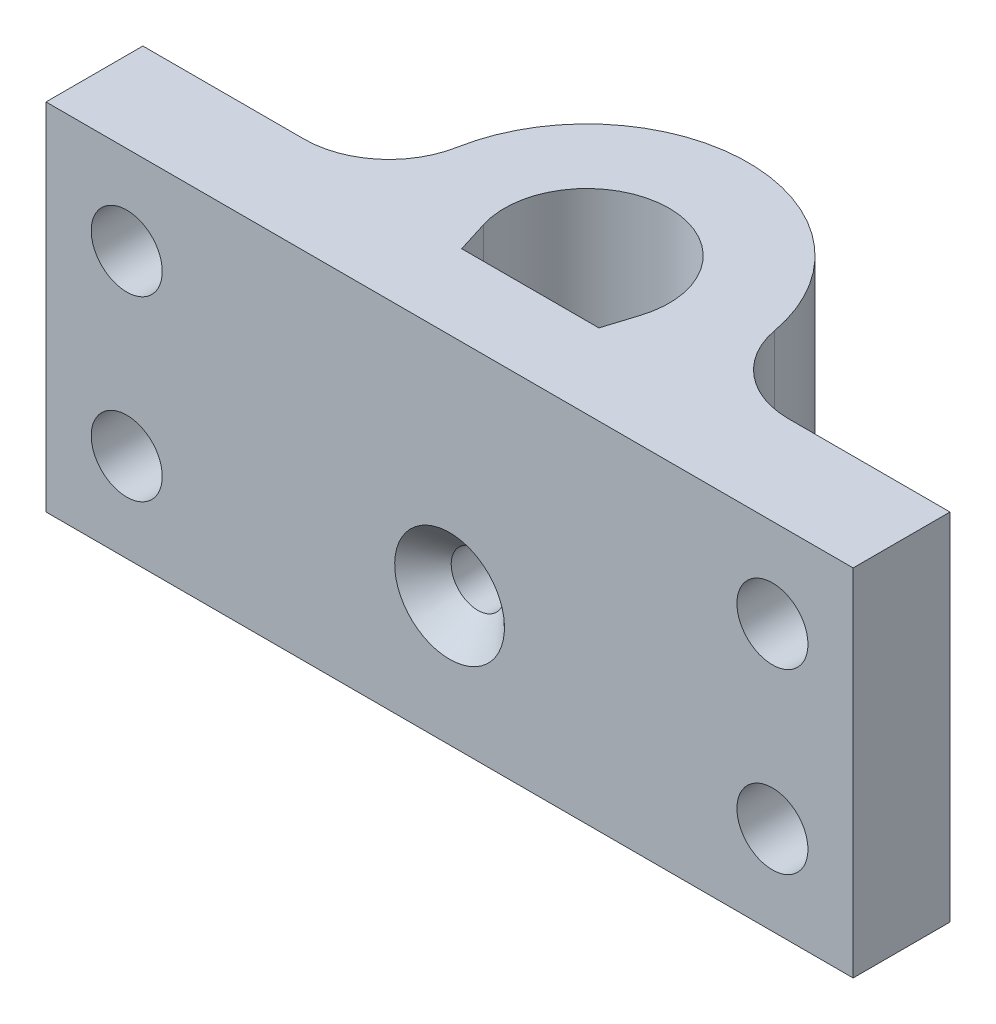
ISO-10303-21;
HEADER;
FILE_DESCRIPTION(('STEP AP214'),'2;1');
FILE_NAME('part.step','',(''),(''),'','','');
FILE_SCHEMA(('AUTOMOTIVE_DESIGN { 1 0 10303 214 1 1 1 1 }'));
ENDSEC;
DATA;
#1=APPLICATION_CONTEXT('core data for automotive mechanical design processes');
#2=APPLICATION_PROTOCOL_DEFINITION('international standard','automotive_design',2000,#1);
#3=PRODUCT_CONTEXT('',#1,'mechanical');
#4=PRODUCT('Part','Part','',(#3));
#5=PRODUCT_RELATED_PRODUCT_CATEGORY('part','',(#4));
#6=PRODUCT_DEFINITION_FORMATION('','',#4);
#7=PRODUCT_DEFINITION_CONTEXT('part definition',#1,'design');
#8=PRODUCT_DEFINITION('design','',#6,#7);
#9=PRODUCT_DEFINITION_SHAPE('','',#8);
#10=(LENGTH_UNIT() NAMED_UNIT(*) SI_UNIT(.MILLI.,.METRE.));
#11=(NAMED_UNIT(*) PLANE_ANGLE_UNIT() SI_UNIT($,.RADIAN.));
#12=(NAMED_UNIT(*) SI_UNIT($,.STERADIAN.) SOLID_ANGLE_UNIT());
#13=UNCERTAINTY_MEASURE_WITH_UNIT(LENGTH_MEASURE(1.E-05),#10,'distance_accuracy_value','');
#14=(GEOMETRIC_REPRESENTATION_CONTEXT(3) GLOBAL_UNCERTAINTY_ASSIGNED_CONTEXT((#13)) GLOBAL_UNIT_ASSIGNED_CONTEXT((#10,
#11,#12)) REPRESENTATION_CONTEXT('',''));
#15=CARTESIAN_POINT('',(0.,0.,0.));
#16=DIRECTION('',(0.,0.,1.));
#17=DIRECTION('',(1.,0.,0.));
#18=AXIS2_PLACEMENT_3D('',#15,#16,#17);
#19=CARTESIAN_POINT('',(-25.,22.,8.5));
#20=DIRECTION('',(0.,0.,-1.));
#21=DIRECTION('',(-1.,0.,0.));
#22=AXIS2_PLACEMENT_3D('',#19,#20,#21);
#23=PLANE('',#22);
#24=CARTESIAN_POINT('',(20.,5.5,8.5));
#25=DIRECTION('',(0.,0.,1.));
#26=DIRECTION('',(1.,0.,0.));
#27=AXIS2_PLACEMENT_3D('',#24,#25,#26);
#28=CIRCLE('',#27,2.2);
#29=CARTESIAN_POINT('',(22.2,5.5,8.5));
#30=VERTEX_POINT('',#29);
#31=EDGE_CURVE('E469',#30,#30,#28,.T.);
#32=ORIENTED_EDGE('',*,*,#31,.F.);
#33=EDGE_LOOP('',(#32));
#34=FACE_BOUND('',#33,.T.);
#35=CARTESIAN_POINT('',(20.,16.5,8.5));
#36=DIRECTION('',(0.,0.,1.));
#37=DIRECTION('',(1.,0.,0.));
#38=AXIS2_PLACEMENT_3D('',#35,#36,#37);
#39=CIRCLE('',#38,2.2);
#40=CARTESIAN_POINT('',(22.2,16.5,8.5));
#41=VERTEX_POINT('',#40);
#42=EDGE_CURVE('E445',#41,#41,#39,.T.);
#43=ORIENTED_EDGE('',*,*,#42,.F.);
#44=EDGE_LOOP('',(#43));
#45=FACE_BOUND('',#44,.T.);
#46=DIRECTION('',(1.,0.,0.));
#47=VECTOR('',#46,1.);
#48=CARTESIAN_POINT('',(-25.,0.,8.5));
#49=LINE('',#48,#47);
#50=CARTESIAN_POINT('',(-25.,0.,8.5));
#51=VERTEX_POINT('',#50);
#52=CARTESIAN_POINT('',(25.,0.,8.5));
#53=VERTEX_POINT('',#52);
#54=EDGE_CURVE('E199',#51,#53,#49,.T.);
#55=ORIENTED_EDGE('',*,*,#54,.T.);
#56=DIRECTION('',(0.,-1.,0.));
#57=VECTOR('',#56,1.);
#58=CARTESIAN_POINT('',(25.,22.,8.5));
#59=LINE('',#58,#57);
#60=CARTESIAN_POINT('',(25.,22.,8.5));
#61=VERTEX_POINT('',#60);
#62=EDGE_CURVE('E220',#61,#53,#59,.T.);
#63=ORIENTED_EDGE('',*,*,#62,.F.);
#64=DIRECTION('',(1.,0.,0.));
#65=VECTOR('',#64,1.);
#66=CARTESIAN_POINT('',(-25.,22.,8.5));
#67=LINE('',#66,#65);
#68=CARTESIAN_POINT('',(-25.,22.,8.5));
#69=VERTEX_POINT('',#68);
#70=EDGE_CURVE('E217',#69,#61,#67,.T.);
#71=ORIENTED_EDGE('',*,*,#70,.F.);
#72=DIRECTION('',(0.,-1.,0.));
#73=VECTOR('',#72,1.);
#74=CARTESIAN_POINT('',(-25.,22.,8.5));
#75=LINE('',#74,#73);
#76=EDGE_CURVE('E247',#69,#51,#75,.T.);
#77=ORIENTED_EDGE('',*,*,#76,.T.);
#78=EDGE_LOOP('',(#55,#63,#71,#77));
#79=FACE_BOUND('',#78,.T.);
#80=CARTESIAN_POINT('',(0.,8.,8.5));
#81=DIRECTION('',(0.,0.,1.));
#82=DIRECTION('',(0.,-1.,0.));
#83=AXIS2_PLACEMENT_3D('',#80,#81,#82);
#84=CIRCLE('',#83,3.4);
#85=CARTESIAN_POINT('',(0.,4.6,8.5));
#86=VERTEX_POINT('',#85);
#87=EDGE_CURVE('E436',#86,#86,#84,.T.);
#88=ORIENTED_EDGE('',*,*,#87,.F.);
#89=EDGE_LOOP('',(#88));
#90=FACE_BOUND('',#89,.T.);
#91=CARTESIAN_POINT('',(-20.,16.5,8.5));
#92=DIRECTION('',(0.,0.,1.));
#93=DIRECTION('',(1.,0.,0.));
#94=AXIS2_PLACEMENT_3D('',#91,#92,#93);
#95=CIRCLE('',#94,2.2);
#96=CARTESIAN_POINT('',(-17.8,16.5,8.5));
#97=VERTEX_POINT('',#96);
#98=EDGE_CURVE('E457',#97,#97,#95,.T.);
#99=ORIENTED_EDGE('',*,*,#98,.F.);
#100=EDGE_LOOP('',(#99));
#101=FACE_BOUND('',#100,.T.);
#102=CARTESIAN_POINT('',(-20.,5.5,8.5));
#103=DIRECTION('',(0.,0.,1.));
#104=DIRECTION('',(1.,0.,0.));
#105=AXIS2_PLACEMENT_3D('',#102,#103,#104);
#106=CIRCLE('',#105,2.2);
#107=CARTESIAN_POINT('',(-17.8,5.5,8.5));
#108=VERTEX_POINT('',#107);
#109=EDGE_CURVE('E481',#108,#108,#106,.T.);
#110=ORIENTED_EDGE('',*,*,#109,.F.);
#111=EDGE_LOOP('',(#110));
#112=FACE_BOUND('',#111,.T.);
#113=ADVANCED_FACE('F17',(#34,#45,#79,#90,#101,#112),#23,.F.);
#114=CARTESIAN_POINT('',(-25.,22.,2.5));
#115=DIRECTION('',(0.,0.,1.));
#116=DIRECTION('',(1.,0.,0.));
#117=AXIS2_PLACEMENT_3D('',#114,#115,#116);
#118=PLANE('',#117);
#119=CARTESIAN_POINT('',(-20.,16.5,2.5));
#120=DIRECTION('',(0.,0.,1.));
#121=DIRECTION('',(1.,0.,0.));
#122=AXIS2_PLACEMENT_3D('',#119,#120,#121);
#123=CIRCLE('',#122,4.5);
#124=CARTESIAN_POINT('',(-15.5,16.5,2.5));
#125=VERTEX_POINT('',#124);
#126=EDGE_CURVE('E461',#125,#125,#123,.T.);
#127=ORIENTED_EDGE('',*,*,#126,.T.);
#128=EDGE_LOOP('',(#127));
#129=FACE_BOUND('',#128,.T.);
#130=DIRECTION('',(-1.,0.,0.));
#131=VECTOR('',#130,1.);
#132=CARTESIAN_POINT('',(-25.,0.,2.5));
#133=LINE('',#132,#131);
#134=CARTESIAN_POINT('',(-15.,0.,2.5));
#135=VERTEX_POINT('',#134);
#136=CARTESIAN_POINT('',(-25.,0.,2.5));
#137=VERTEX_POINT('',#136);
#138=EDGE_CURVE('E236',#135,#137,#133,.T.);
#139=ORIENTED_EDGE('',*,*,#138,.T.);
#140=DIRECTION('',(0.,-1.,0.));
#141=VECTOR('',#140,1.);
#142=CARTESIAN_POINT('',(-25.,22.,2.5));
#143=LINE('',#142,#141);
#144=CARTESIAN_POINT('',(-25.,22.,2.5));
#145=VERTEX_POINT('',#144);
#146=EDGE_CURVE('E251',#145,#137,#143,.T.);
#147=ORIENTED_EDGE('',*,*,#146,.F.);
#148=DIRECTION('',(-1.,0.,0.));
#149=VECTOR('',#148,1.);
#150=CARTESIAN_POINT('',(-25.,22.,2.5));
#151=LINE('',#150,#149);
#152=CARTESIAN_POINT('',(-15.,22.,2.5));
#153=VERTEX_POINT('',#152);
#154=EDGE_CURVE('E211',#153,#145,#151,.T.);
#155=ORIENTED_EDGE('',*,*,#154,.F.);
#156=DIRECTION('',(0.,-1.,0.));
#157=VECTOR('',#156,1.);
#158=CARTESIAN_POINT('',(-15.,22.,2.5));
#159=LINE('',#158,#157);
#160=EDGE_CURVE('E255',#153,#135,#159,.T.);
#161=ORIENTED_EDGE('',*,*,#160,.T.);
#162=EDGE_LOOP('',(#139,#147,#155,#161));
#163=FACE_BOUND('',#162,.T.);
#164=CARTESIAN_POINT('',(-20.,5.5,2.5));
#165=DIRECTION('',(0.,0.,1.));
#166=DIRECTION('',(1.,0.,0.));
#167=AXIS2_PLACEMENT_3D('',#164,#165,#166);
#168=CIRCLE('',#167,4.5);
#169=CARTESIAN_POINT('',(-15.5,5.5,2.5));
#170=VERTEX_POINT('',#169);
#171=EDGE_CURVE('E485',#170,#170,#168,.T.);
#172=ORIENTED_EDGE('',*,*,#171,.T.);
#173=EDGE_LOOP('',(#172));
#174=FACE_BOUND('',#173,.T.);
#175=ADVANCED_FACE('F352',(#129,#163,#174),#118,.F.);
#176=CARTESIAN_POINT('',(25.,22.,2.5));
#177=DIRECTION('',(0.,0.,1.));
#178=DIRECTION('',(1.,0.,0.));
#179=AXIS2_PLACEMENT_3D('',#176,#177,#178);
#180=PLANE('',#179);
#181=CARTESIAN_POINT('',(20.,16.5,2.5));
#182=DIRECTION('',(0.,0.,1.));
#183=DIRECTION('',(1.,0.,0.));
#184=AXIS2_PLACEMENT_3D('',#181,#182,#183);
#185=CIRCLE('',#184,4.5);
#186=CARTESIAN_POINT('',(24.5,16.5,2.5));
#187=VERTEX_POINT('',#186);
#188=EDGE_CURVE('E449',#187,#187,#185,.T.);
#189=ORIENTED_EDGE('',*,*,#188,.T.);
#190=EDGE_LOOP('',(#189));
#191=FACE_BOUND('',#190,.T.);
#192=DIRECTION('',(-1.,0.,0.));
#193=VECTOR('',#192,1.);
#194=CARTESIAN_POINT('',(25.,0.,2.5));
#195=LINE('',#194,#193);
#196=CARTESIAN_POINT('',(25.,0.,2.5));
#197=VERTEX_POINT('',#196);
#198=CARTESIAN_POINT('',(15.,0.,2.5));
#199=VERTEX_POINT('',#198);
#200=EDGE_CURVE('E224',#197,#199,#195,.T.);
#201=ORIENTED_EDGE('',*,*,#200,.T.);
#202=DIRECTION('',(0.,-1.,0.));
#203=VECTOR('',#202,1.);
#204=CARTESIAN_POINT('',(15.,22.,2.5));
#205=LINE('',#204,#203);
#206=CARTESIAN_POINT('',(15.,22.,2.5));
#207=VERTEX_POINT('',#206);
#208=EDGE_CURVE('E267',#207,#199,#205,.T.);
#209=ORIENTED_EDGE('',*,*,#208,.F.);
#210=DIRECTION('',(-1.,0.,0.));
#211=VECTOR('',#210,1.);
#212=CARTESIAN_POINT('',(25.,22.,2.5));
#213=LINE('',#212,#211);
#214=CARTESIAN_POINT('',(25.,22.,2.5));
#215=VERTEX_POINT('',#214);
#216=EDGE_CURVE('E198',#215,#207,#213,.T.);
#217=ORIENTED_EDGE('',*,*,#216,.F.);
#218=DIRECTION('',(0.,-1.,0.));
#219=VECTOR('',#218,1.);
#220=CARTESIAN_POINT('',(25.,22.,2.5));
#221=LINE('',#220,#219);
#222=EDGE_CURVE('E271',#215,#197,#221,.T.);
#223=ORIENTED_EDGE('',*,*,#222,.T.);
#224=EDGE_LOOP('',(#201,#209,#217,#223));
#225=FACE_BOUND('',#224,.T.);
#226=CARTESIAN_POINT('',(20.,5.5,2.5));
#227=DIRECTION('',(0.,0.,1.));
#228=DIRECTION('',(1.,0.,0.));
#229=AXIS2_PLACEMENT_3D('',#226,#227,#228);
#230=CIRCLE('',#229,4.5);
#231=CARTESIAN_POINT('',(24.5,5.5,2.5));
#232=VERTEX_POINT('',#231);
#233=EDGE_CURVE('E473',#232,#232,#230,.T.);
#234=ORIENTED_EDGE('',*,*,#233,.T.);
#235=EDGE_LOOP('',(#234));
#236=FACE_BOUND('',#235,.T.);
#237=ADVANCED_FACE('F369',(#191,#225,#236),#180,.F.);
#238=CARTESIAN_POINT('',(0.,8.,-1.16690475583121));
#239=DIRECTION('',(0.,0.,1.));
#240=DIRECTION('',(1.,0.,0.));
#241=AXIS2_PLACEMENT_3D('',#238,#239,#240);
#242=CYLINDRICAL_SURFACE('',#241,1.65);
#243=CARTESIAN_POINT('',(0.,8.,3.5));
#244=DIRECTION('',(0.,0.,-1.));
#245=DIRECTION('',(-1.,0.,0.));
#246=AXIS2_PLACEMENT_3D('',#243,#244,#245);
#247=CIRCLE('',#246,1.65);
#248=CARTESIAN_POINT('',(-1.65,8.,3.5));
#249=VERTEX_POINT('',#248);
#250=EDGE_CURVE('E299',#249,#249,#247,.F.);
#251=ORIENTED_EDGE('',*,*,#250,.F.);
#252=EDGE_LOOP('',(#251));
#253=FACE_BOUND('',#252,.T.);
#254=CARTESIAN_POINT('',(0.,8.,6.75));
#255=DIRECTION('',(0.,0.,1.));
#256=DIRECTION('',(0.,-1.,0.));
#257=AXIS2_PLACEMENT_3D('',#254,#255,#256);
#258=CIRCLE('',#257,1.65);
#259=CARTESIAN_POINT('',(0.,6.35,6.75));
#260=VERTEX_POINT('',#259);
#261=EDGE_CURVE('E21',#260,#260,#258,.F.);
#262=ORIENTED_EDGE('',*,*,#261,.F.);
#263=EDGE_LOOP('',(#262));
#264=FACE_BOUND('',#263,.T.);
#265=ADVANCED_FACE('F373',(#253,#264),#242,.F.);
#266=CARTESIAN_POINT('',(15.,22.,-2.75));
#267=DIRECTION('',(0.,1.,0.));
#268=DIRECTION('',(0.,0.,1.));
#269=AXIS2_PLACEMENT_3D('',#266,#267,#268);
#270=PLANE('',#269);
#271=DIRECTION('',(0.,0.,-1.));
#272=VECTOR('',#271,1.);
#273=CARTESIAN_POINT('',(25.,22.,8.5));
#274=LINE('',#273,#272);
#275=EDGE_CURVE('E194',#61,#215,#274,.T.);
#276=ORIENTED_EDGE('',*,*,#275,.T.);
#277=ORIENTED_EDGE('',*,*,#216,.T.);
#278=CARTESIAN_POINT('',(15.,22.,-2.75));
#279=DIRECTION('',(0.,-1.,0.));
#280=DIRECTION('',(0.,0.,1.));
#281=AXIS2_PLACEMENT_3D('',#278,#279,#280);
#282=CIRCLE('',#281,5.25);
#283=CARTESIAN_POINT('',(9.83606557377049,22.,-1.80327868852459));
#284=VERTEX_POINT('',#283);
#285=EDGE_CURVE('E202',#207,#284,#282,.T.);
#286=ORIENTED_EDGE('',*,*,#285,.T.);
#287=CARTESIAN_POINT('',(0.,22.,0.));
#288=DIRECTION('',(0.,1.,0.));
#289=DIRECTION('',(0.,0.,-1.));
#290=AXIS2_PLACEMENT_3D('',#287,#288,#289);
#291=CIRCLE('',#290,10.);
#292=CARTESIAN_POINT('',(-9.83606557377049,22.,-1.80327868852459));
#293=VERTEX_POINT('',#292);
#294=EDGE_CURVE('E205',#284,#293,#291,.T.);
#295=ORIENTED_EDGE('',*,*,#294,.T.);
#296=CARTESIAN_POINT('',(-15.,22.,-2.75));
#297=DIRECTION('',(0.,-1.,0.));
#298=DIRECTION('',(0.,0.,-1.));
#299=AXIS2_PLACEMENT_3D('',#296,#297,#298);
#300=CIRCLE('',#299,5.25);
#301=EDGE_CURVE('E208',#293,#153,#300,.T.);
#302=ORIENTED_EDGE('',*,*,#301,.T.);
#303=ORIENTED_EDGE('',*,*,#154,.T.);
#304=DIRECTION('',(0.,0.,1.));
#305=VECTOR('',#304,1.);
#306=CARTESIAN_POINT('',(-25.,22.,8.5));
#307=LINE('',#306,#305);
#308=EDGE_CURVE('E214',#145,#69,#307,.T.);
#309=ORIENTED_EDGE('',*,*,#308,.T.);
#310=ORIENTED_EDGE('',*,*,#70,.T.);
#311=EDGE_LOOP('',(#276,#277,#286,#295,#302,#303,#309,#310));
#312=FACE_BOUND('',#311,.T.);
#313=DIRECTION('',(0.298043740440614,0.,-0.954552213754789));
#314=VECTOR('',#313,1.);
#315=CARTESIAN_POINT('',(4.25,22.,3.5));
#316=LINE('',#315,#314);
#317=CARTESIAN_POINT('',(4.25,22.,3.5));
#318=VERTEX_POINT('',#317);
#319=CARTESIAN_POINT('',(4.86821629014943,22.,1.52002307624713));
#320=VERTEX_POINT('',#319);
#321=EDGE_CURVE('E159',#318,#320,#316,.T.);
#322=ORIENTED_EDGE('',*,*,#321,.F.);
#323=DIRECTION('',(1.,0.,0.));
#324=VECTOR('',#323,1.);
#325=CARTESIAN_POINT('',(-3.70944739819828,22.,3.5));
#326=LINE('',#325,#324);
#327=CARTESIAN_POINT('',(-4.25,22.,3.5));
#328=VERTEX_POINT('',#327);
#329=EDGE_CURVE('E150',#328,#318,#326,.T.);
#330=ORIENTED_EDGE('',*,*,#329,.F.);
#331=DIRECTION('',(0.298043740440614,0.,0.954552213754789));
#332=VECTOR('',#331,1.);
#333=CARTESIAN_POINT('',(-4.25,22.,3.5));
#334=LINE('',#333,#332);
#335=CARTESIAN_POINT('',(-4.86821629014942,22.,1.52002307624713));
#336=VERTEX_POINT('',#335);
#337=EDGE_CURVE('E181',#336,#328,#334,.T.);
#338=ORIENTED_EDGE('',*,*,#337,.F.);
#339=CARTESIAN_POINT('',(0.,22.,0.));
#340=DIRECTION('',(0.,1.,0.));
#341=DIRECTION('',(0.,0.,-1.));
#342=AXIS2_PLACEMENT_3D('',#339,#340,#341);
#343=CIRCLE('',#342,5.1);
#344=EDGE_CURVE('E176',#320,#336,#343,.T.);
#345=ORIENTED_EDGE('',*,*,#344,.F.);
#346=EDGE_LOOP('',(#322,#330,#338,#345));
#347=FACE_BOUND('',#346,.T.);
#348=ADVANCED_FACE('F174',(#312,#347),#270,.T.);
#349=CARTESIAN_POINT('',(15.,0.,-2.75));
#350=DIRECTION('',(0.,1.,0.));
#351=DIRECTION('',(0.,0.,1.));
#352=AXIS2_PLACEMENT_3D('',#349,#350,#351);
#353=PLANE('',#352);
#354=DIRECTION('',(1.,0.,0.));
#355=VECTOR('',#354,1.);
#356=CARTESIAN_POINT('',(4.25,0.,4.36602540378445));
#357=LINE('',#356,#355);
#358=CARTESIAN_POINT('',(-4.88685563174452,0.,4.36602540378445));
#359=VERTEX_POINT('',#358);
#360=CARTESIAN_POINT('',(4.88685563174452,0.,4.36602540378445));
#361=VERTEX_POINT('',#360);
#362=EDGE_CURVE('E278',#359,#361,#357,.T.);
#363=ORIENTED_EDGE('',*,*,#362,.T.);
#364=DIRECTION('',(0.298043740440614,0.,-0.954552213754789));
#365=VECTOR('',#364,1.);
#366=CARTESIAN_POINT('',(5.69488275649975,0.,1.77813652690764));
#367=LINE('',#366,#365);
#368=CARTESIAN_POINT('',(5.69488275649975,0.,1.77813652690764));
#369=VERTEX_POINT('',#368);
#370=EDGE_CURVE('E284',#361,#369,#367,.T.);
#371=ORIENTED_EDGE('',*,*,#370,.T.);
#372=CARTESIAN_POINT('',(0.,0.,0.));
#373=DIRECTION('',(0.,1.,0.));
#374=DIRECTION('',(0.,0.,1.));
#375=AXIS2_PLACEMENT_3D('',#372,#373,#374);
#376=CIRCLE('',#375,5.96602540378445);
#377=CARTESIAN_POINT('',(-5.69488275649975,0.,1.77813652690764));
#378=VERTEX_POINT('',#377);
#379=EDGE_CURVE('E281',#369,#378,#376,.T.);
#380=ORIENTED_EDGE('',*,*,#379,.T.);
#381=DIRECTION('',(0.298043740440614,0.,0.954552213754789));
#382=VECTOR('',#381,1.);
#383=CARTESIAN_POINT('',(-5.07666646635033,0.,3.75811345066051));
#384=LINE('',#383,#382);
#385=EDGE_CURVE('E275',#378,#359,#384,.T.);
#386=ORIENTED_EDGE('',*,*,#385,.T.);
#387=EDGE_LOOP('',(#363,#371,#380,#386));
#388=FACE_BOUND('',#387,.T.);
#389=DIRECTION('',(0.,0.,-1.));
#390=VECTOR('',#389,1.);
#391=CARTESIAN_POINT('',(25.,0.,8.5));
#392=LINE('',#391,#390);
#393=EDGE_CURVE('E170',#53,#197,#392,.T.);
#394=ORIENTED_EDGE('',*,*,#393,.F.);
#395=ORIENTED_EDGE('',*,*,#54,.F.);
#396=DIRECTION('',(0.,0.,1.));
#397=VECTOR('',#396,1.);
#398=CARTESIAN_POINT('',(-25.,0.,8.5));
#399=LINE('',#398,#397);
#400=EDGE_CURVE('E239',#137,#51,#399,.T.);
#401=ORIENTED_EDGE('',*,*,#400,.F.);
#402=ORIENTED_EDGE('',*,*,#138,.F.);
#403=CARTESIAN_POINT('',(-15.,0.,-2.75));
#404=DIRECTION('',(0.,-1.,0.));
#405=DIRECTION('',(0.,0.,-1.));
#406=AXIS2_PLACEMENT_3D('',#403,#404,#405);
#407=CIRCLE('',#406,5.25);
#408=CARTESIAN_POINT('',(-9.83606557377049,0.,-1.80327868852459));
#409=VERTEX_POINT('',#408);
#410=EDGE_CURVE('E233',#409,#135,#407,.T.);
#411=ORIENTED_EDGE('',*,*,#410,.F.);
#412=CARTESIAN_POINT('',(0.,0.,0.));
#413=DIRECTION('',(0.,1.,0.));
#414=DIRECTION('',(0.,0.,-1.));
#415=AXIS2_PLACEMENT_3D('',#412,#413,#414);
#416=CIRCLE('',#415,10.);
#417=CARTESIAN_POINT('',(9.83606557377049,0.,-1.80327868852459));
#418=VERTEX_POINT('',#417);
#419=EDGE_CURVE('E230',#418,#409,#416,.T.);
#420=ORIENTED_EDGE('',*,*,#419,.F.);
#421=CARTESIAN_POINT('',(15.,0.,-2.75));
#422=DIRECTION('',(0.,-1.,0.));
#423=DIRECTION('',(0.,0.,1.));
#424=AXIS2_PLACEMENT_3D('',#421,#422,#423);
#425=CIRCLE('',#424,5.25);
#426=EDGE_CURVE('E227',#199,#418,#425,.T.);
#427=ORIENTED_EDGE('',*,*,#426,.F.);
#428=ORIENTED_EDGE('',*,*,#200,.F.);
#429=EDGE_LOOP('',(#394,#395,#401,#402,#411,#420,#427,#428));
#430=FACE_BOUND('',#429,.T.);
#431=ADVANCED_FACE('F327',(#388,#430),#353,.F.);
#432=CARTESIAN_POINT('',(25.,22.,8.5));
#433=DIRECTION('',(-1.,0.,0.));
#434=DIRECTION('',(0.,0.,1.));
#435=AXIS2_PLACEMENT_3D('',#432,#433,#434);
#436=PLANE('',#435);
#437=ORIENTED_EDGE('',*,*,#393,.T.);
#438=ORIENTED_EDGE('',*,*,#222,.F.);
#439=ORIENTED_EDGE('',*,*,#275,.F.);
#440=ORIENTED_EDGE('',*,*,#62,.T.);
#441=EDGE_LOOP('',(#437,#438,#439,#440));
#442=FACE_BOUND('',#441,.T.);
#443=ADVANCED_FACE('F330',(#442),#436,.F.);
#444=CARTESIAN_POINT('',(15.,22.,-2.75));
#445=DIRECTION('',(0.,-1.,0.));
#446=DIRECTION('',(0.,0.,-1.));
#447=AXIS2_PLACEMENT_3D('',#444,#445,#446);
#448=CYLINDRICAL_SURFACE('',#447,5.25);
#449=ORIENTED_EDGE('',*,*,#426,.T.);
#450=DIRECTION('',(0.,-1.,0.));
#451=VECTOR('',#450,1.);
#452=CARTESIAN_POINT('',(9.83606557377049,22.,-1.80327868852459));
#453=LINE('',#452,#451);
#454=EDGE_CURVE('E263',#284,#418,#453,.T.);
#455=ORIENTED_EDGE('',*,*,#454,.F.);
#456=ORIENTED_EDGE('',*,*,#285,.F.);
#457=ORIENTED_EDGE('',*,*,#208,.T.);
#458=EDGE_LOOP('',(#449,#455,#456,#457));
#459=FACE_BOUND('',#458,.T.);
#460=ADVANCED_FACE('F365',(#459),#448,.F.);
#461=CARTESIAN_POINT('',(0.,22.,0.));
#462=DIRECTION('',(0.,-1.,0.));
#463=DIRECTION('',(0.,0.,-1.));
#464=AXIS2_PLACEMENT_3D('',#461,#462,#463);
#465=CYLINDRICAL_SURFACE('',#464,10.);
#466=ORIENTED_EDGE('',*,*,#419,.T.);
#467=DIRECTION('',(0.,-1.,0.));
#468=VECTOR('',#467,1.);
#469=CARTESIAN_POINT('',(-9.83606557377049,22.,-1.80327868852459));
#470=LINE('',#469,#468);
#471=EDGE_CURVE('E259',#293,#409,#470,.T.);
#472=ORIENTED_EDGE('',*,*,#471,.F.);
#473=ORIENTED_EDGE('',*,*,#294,.F.);
#474=ORIENTED_EDGE('',*,*,#454,.T.);
#475=EDGE_LOOP('',(#466,#472,#473,#474));
#476=FACE_BOUND('',#475,.T.);
#477=ADVANCED_FACE('F362',(#476),#465,.T.);
#478=CARTESIAN_POINT('',(-15.,22.,-2.75));
#479=DIRECTION('',(0.,-1.,0.));
#480=DIRECTION('',(0.,0.,-1.));
#481=AXIS2_PLACEMENT_3D('',#478,#479,#480);
#482=CYLINDRICAL_SURFACE('',#481,5.25);
#483=ORIENTED_EDGE('',*,*,#410,.T.);
#484=ORIENTED_EDGE('',*,*,#160,.F.);
#485=ORIENTED_EDGE('',*,*,#301,.F.);
#486=ORIENTED_EDGE('',*,*,#471,.T.);
#487=EDGE_LOOP('',(#483,#484,#485,#486));
#488=FACE_BOUND('',#487,.T.);
#489=ADVANCED_FACE('F358',(#488),#482,.F.);
#490=CARTESIAN_POINT('',(-25.,22.,8.5));
#491=DIRECTION('',(1.,0.,0.));
#492=DIRECTION('',(0.,0.,-1.));
#493=AXIS2_PLACEMENT_3D('',#490,#491,#492);
#494=PLANE('',#493);
#495=ORIENTED_EDGE('',*,*,#400,.T.);
#496=ORIENTED_EDGE('',*,*,#76,.F.);
#497=ORIENTED_EDGE('',*,*,#308,.F.);
#498=ORIENTED_EDGE('',*,*,#146,.T.);
#499=EDGE_LOOP('',(#495,#496,#497,#498));
#500=FACE_BOUND('',#499,.T.);
#501=ADVANCED_FACE('F346',(#500),#494,.F.);
#502=CARTESIAN_POINT('',(3.70944739819828,22.,3.5));
#503=DIRECTION('',(0.,0.,-1.));
#504=DIRECTION('',(-1.,0.,0.));
#505=AXIS2_PLACEMENT_3D('',#502,#503,#504);
#506=PLANE('',#505);
#507=ORIENTED_EDGE('',*,*,#250,.T.);
#508=EDGE_LOOP('',(#507));
#509=FACE_BOUND('',#508,.T.);
#510=DIRECTION('',(0.,-1.,0.));
#511=VECTOR('',#510,1.);
#512=CARTESIAN_POINT('',(4.25,22.,3.5));
#513=LINE('',#512,#511);
#514=CARTESIAN_POINT('',(4.25,1.5,3.5));
#515=VERTEX_POINT('',#514);
#516=EDGE_CURVE('E153',#318,#515,#513,.T.);
#517=ORIENTED_EDGE('',*,*,#516,.T.);
#518=DIRECTION('',(-1.,0.,0.));
#519=VECTOR('',#518,1.);
#520=CARTESIAN_POINT('',(-4.25,1.5,3.5));
#521=LINE('',#520,#519);
#522=CARTESIAN_POINT('',(-4.25,1.5,3.5));
#523=VERTEX_POINT('',#522);
#524=EDGE_CURVE('E27',#515,#523,#521,.T.);
#525=ORIENTED_EDGE('',*,*,#524,.T.);
#526=DIRECTION('',(0.,-1.,0.));
#527=VECTOR('',#526,1.);
#528=CARTESIAN_POINT('',(-4.25,22.,3.5));
#529=LINE('',#528,#527);
#530=EDGE_CURVE('E154',#328,#523,#529,.T.);
#531=ORIENTED_EDGE('',*,*,#530,.F.);
#532=ORIENTED_EDGE('',*,*,#329,.T.);
#533=EDGE_LOOP('',(#517,#525,#531,#532));
#534=FACE_BOUND('',#533,.T.);
#535=ADVANCED_FACE('F152',(#509,#534),#506,.T.);
#536=CARTESIAN_POINT('',(4.25,22.,3.5));
#537=DIRECTION('',(-0.954552213754789,0.,-0.298043740440614));
#538=DIRECTION('',(-0.298043740440614,0.,0.954552213754789));
#539=AXIS2_PLACEMENT_3D('',#536,#537,#538);
#540=PLANE('',#539);
#541=DIRECTION('',(0.,-1.,0.));
#542=VECTOR('',#541,1.);
#543=CARTESIAN_POINT('',(4.86821629014943,22.,1.52002307624713));
#544=LINE('',#543,#542);
#545=CARTESIAN_POINT('',(4.86821629014943,1.5,1.52002307624713));
#546=VERTEX_POINT('',#545);
#547=EDGE_CURVE('E171',#320,#546,#544,.T.);
#548=ORIENTED_EDGE('',*,*,#547,.T.);
#549=DIRECTION('',(-0.298043740440614,0.,0.954552213754789));
#550=VECTOR('',#549,1.);
#551=CARTESIAN_POINT('',(4.25,1.5,3.5));
#552=LINE('',#551,#550);
#553=EDGE_CURVE('E168',#546,#515,#552,.T.);
#554=ORIENTED_EDGE('',*,*,#553,.T.);
#555=ORIENTED_EDGE('',*,*,#516,.F.);
#556=ORIENTED_EDGE('',*,*,#321,.T.);
#557=EDGE_LOOP('',(#548,#554,#555,#556));
#558=FACE_BOUND('',#557,.T.);
#559=ADVANCED_FACE('F165',(#558),#540,.T.);
#560=CARTESIAN_POINT('',(0.,22.,0.));
#561=DIRECTION('',(0.,-1.,0.));
#562=DIRECTION('',(0.,0.,-1.));
#563=AXIS2_PLACEMENT_3D('',#560,#561,#562);
#564=CYLINDRICAL_SURFACE('',#563,5.1);
#565=DIRECTION('',(0.,-1.,0.));
#566=VECTOR('',#565,1.);
#567=CARTESIAN_POINT('',(-4.86821629014942,22.,1.52002307624713));
#568=LINE('',#567,#566);
#569=CARTESIAN_POINT('',(-4.86821629014942,1.5,1.52002307624713));
#570=VERTEX_POINT('',#569);
#571=EDGE_CURVE('E189',#336,#570,#568,.T.);
#572=ORIENTED_EDGE('',*,*,#571,.T.);
#573=CARTESIAN_POINT('',(0.,1.5,0.));
#574=DIRECTION('',(0.,1.,0.));
#575=DIRECTION('',(0.,0.,1.));
#576=AXIS2_PLACEMENT_3D('',#573,#574,#575);
#577=CIRCLE('',#576,5.1);
#578=EDGE_CURVE('E290',#570,#546,#577,.F.);
#579=ORIENTED_EDGE('',*,*,#578,.T.);
#580=ORIENTED_EDGE('',*,*,#547,.F.);
#581=ORIENTED_EDGE('',*,*,#344,.T.);
#582=EDGE_LOOP('',(#572,#579,#580,#581));
#583=FACE_BOUND('',#582,.T.);
#584=ADVANCED_FACE('F322',(#583),#564,.F.);
#585=CARTESIAN_POINT('',(-4.25,22.,3.5));
#586=DIRECTION('',(0.954552213754789,0.,-0.298043740440614));
#587=DIRECTION('',(-0.298043740440614,0.,-0.954552213754789));
#588=AXIS2_PLACEMENT_3D('',#585,#586,#587);
#589=PLANE('',#588);
#590=ORIENTED_EDGE('',*,*,#530,.T.);
#591=DIRECTION('',(-0.298043740440614,0.,-0.954552213754789));
#592=VECTOR('',#591,1.);
#593=CARTESIAN_POINT('',(-4.86821629014942,1.5,1.52002307624713));
#594=LINE('',#593,#592);
#595=EDGE_CURVE('E11',#523,#570,#594,.T.);
#596=ORIENTED_EDGE('',*,*,#595,.T.);
#597=ORIENTED_EDGE('',*,*,#571,.F.);
#598=ORIENTED_EDGE('',*,*,#337,.T.);
#599=EDGE_LOOP('',(#590,#596,#597,#598));
#600=FACE_BOUND('',#599,.T.);
#601=ADVANCED_FACE('F414',(#600),#589,.T.);
#602=CARTESIAN_POINT('',(-5.14480204690397,0.,3.53989390625136));
#603=DIRECTION('',(0.826666466350322,-0.5,-0.258113450660508));
#604=DIRECTION('',(0.517536939166172,0.855660865412524,0.));
#605=AXIS2_PLACEMENT_3D('',#602,#603,#604);
#606=PLANE('',#605);
#607=DIRECTION('',(-0.477276106877393,-0.86602540378444,0.149021870220306));
#608=VECTOR('',#607,1.);
#609=CARTESIAN_POINT('',(-4.86821629014942,1.5,1.52002307624713));
#610=LINE('',#609,#608);
#611=EDGE_CURVE('E302',#570,#378,#610,.T.);
#612=ORIENTED_EDGE('',*,*,#611,.F.);
#613=ORIENTED_EDGE('',*,*,#595,.F.);
#614=DIRECTION('',(-0.345100131988394,-0.812821889577412,0.469282936750739));
#615=VECTOR('',#614,1.);
#616=CARTESIAN_POINT('',(-2.51844843660811,5.57836127313987,1.14535702110017));
#617=LINE('',#616,#615);
#618=EDGE_CURVE('E160',#359,#523,#617,.F.);
#619=ORIENTED_EDGE('',*,*,#618,.F.);
#620=ORIENTED_EDGE('',*,*,#385,.F.);
#621=EDGE_LOOP('',(#612,#613,#619,#620));
#622=FACE_BOUND('',#621,.T.);
#623=ADVANCED_FACE('F19',(#622),#606,.T.);
#624=CARTESIAN_POINT('',(15.,0.,4.36602540378443));
#625=DIRECTION('',(0.,-0.5,-0.866025403784439));
#626=DIRECTION('',(0.,0.866025403784439,-0.5));
#627=AXIS2_PLACEMENT_3D('',#624,#625,#626);
#628=PLANE('',#627);
#629=ORIENTED_EDGE('',*,*,#618,.T.);
#630=ORIENTED_EDGE('',*,*,#524,.F.);
#631=DIRECTION('',(0.345100131988394,-0.812821889577412,0.469282936750738));
#632=VECTOR('',#631,1.);
#633=CARTESIAN_POINT('',(3.71892631912391,2.75084945724988,2.7778217291411));
#634=LINE('',#633,#632);
#635=EDGE_CURVE('E298',#361,#515,#634,.F.);
#636=ORIENTED_EDGE('',*,*,#635,.F.);
#637=ORIENTED_EDGE('',*,*,#362,.F.);
#638=EDGE_LOOP('',(#629,#630,#636,#637));
#639=FACE_BOUND('',#638,.T.);
#640=ADVANCED_FACE('F311',(#639),#628,.T.);
#641=CARTESIAN_POINT('',(0.,0.,0.));
#642=DIRECTION('',(0.,-1.,0.));
#643=DIRECTION('',(0.,0.,-1.));
#644=AXIS2_PLACEMENT_3D('',#641,#642,#643);
#645=CONICAL_SURFACE('',#644,5.96602540378445,0.523598775598299);
#646=ORIENTED_EDGE('',*,*,#611,.T.);
#647=ORIENTED_EDGE('',*,*,#379,.F.);
#648=DIRECTION('',(0.477276106877393,-0.86602540378444,0.149021870220307));
#649=VECTOR('',#648,1.);
#650=CARTESIAN_POINT('',(4.86821629014942,1.5,1.52002307624713));
#651=LINE('',#650,#649);
#652=EDGE_CURVE('E295',#546,#369,#651,.T.);
#653=ORIENTED_EDGE('',*,*,#652,.F.);
#654=ORIENTED_EDGE('',*,*,#578,.F.);
#655=EDGE_LOOP('',(#646,#647,#653,#654));
#656=FACE_BOUND('',#655,.T.);
#657=ADVANCED_FACE('F320',(#656),#645,.F.);
#658=CARTESIAN_POINT('',(7.80970418337893,0.,-4.995055460749));
#659=DIRECTION('',(-0.826666466350322,-0.5,-0.258113450660508));
#660=DIRECTION('',(0.517536939166172,-0.855660865412524,0.));
#661=AXIS2_PLACEMENT_3D('',#658,#659,#660);
#662=PLANE('',#661);
#663=ORIENTED_EDGE('',*,*,#635,.T.);
#664=ORIENTED_EDGE('',*,*,#553,.F.);
#665=ORIENTED_EDGE('',*,*,#652,.T.);
#666=ORIENTED_EDGE('',*,*,#370,.F.);
#667=EDGE_LOOP('',(#663,#664,#665,#666));
#668=FACE_BOUND('',#667,.T.);
#669=ADVANCED_FACE('F324',(#668),#662,.T.);
#670=CARTESIAN_POINT('',(0.,8.,5.1));
#671=DIRECTION('',(0.,0.,1.));
#672=DIRECTION('',(0.,-1.,0.));
#673=AXIS2_PLACEMENT_3D('',#670,#671,#672);
#674=CONICAL_SURFACE('',#673,0.,0.785398163397448);
#675=ORIENTED_EDGE('',*,*,#87,.T.);
#676=EDGE_LOOP('',(#675));
#677=FACE_BOUND('',#676,.T.);
#678=ORIENTED_EDGE('',*,*,#261,.T.);
#679=EDGE_LOOP('',(#678));
#680=FACE_BOUND('',#679,.T.);
#681=ADVANCED_FACE('F408',(#677,#680),#674,.F.);
#682=CARTESIAN_POINT('',(20.,16.5,2.5));
#683=DIRECTION('',(0.,0.,-1.));
#684=DIRECTION('',(-1.,0.,0.));
#685=AXIS2_PLACEMENT_3D('',#682,#683,#684);
#686=CONICAL_SURFACE('',#685,4.5,0.785398163397449);
#687=CARTESIAN_POINT('',(20.,16.5,4.8));
#688=DIRECTION('',(0.,0.,1.));
#689=DIRECTION('',(1.,0.,0.));
#690=AXIS2_PLACEMENT_3D('',#687,#688,#689);
#691=CIRCLE('',#690,2.2);
#692=CARTESIAN_POINT('',(22.2,16.5,4.8));
#693=VERTEX_POINT('',#692);
#694=EDGE_CURVE('E441',#693,#693,#691,.T.);
#695=ORIENTED_EDGE('',*,*,#694,.T.);
#696=EDGE_LOOP('',(#695));
#697=FACE_BOUND('',#696,.T.);
#698=ORIENTED_EDGE('',*,*,#188,.F.);
#699=EDGE_LOOP('',(#698));
#700=FACE_BOUND('',#699,.T.);
#701=ADVANCED_FACE('F522',(#697,#700),#686,.F.);
#702=CARTESIAN_POINT('',(20.,16.5,7.));
#703=DIRECTION('',(0.,0.,1.));
#704=DIRECTION('',(1.,0.,0.));
#705=AXIS2_PLACEMENT_3D('',#702,#703,#704);
#706=CYLINDRICAL_SURFACE('',#705,2.2);
#707=ORIENTED_EDGE('',*,*,#42,.T.);
#708=EDGE_LOOP('',(#707));
#709=FACE_BOUND('',#708,.T.);
#710=ORIENTED_EDGE('',*,*,#694,.F.);
#711=EDGE_LOOP('',(#710));
#712=FACE_BOUND('',#711,.T.);
#713=ADVANCED_FACE('F518',(#709,#712),#706,.F.);
#714=CARTESIAN_POINT('',(-20.,16.5,2.5));
#715=DIRECTION('',(0.,0.,-1.));
#716=DIRECTION('',(-1.,0.,0.));
#717=AXIS2_PLACEMENT_3D('',#714,#715,#716);
#718=CONICAL_SURFACE('',#717,4.5,0.785398163397449);
#719=CARTESIAN_POINT('',(-20.,16.5,4.8));
#720=DIRECTION('',(0.,0.,1.));
#721=DIRECTION('',(1.,0.,0.));
#722=AXIS2_PLACEMENT_3D('',#719,#720,#721);
#723=CIRCLE('',#722,2.2);
#724=CARTESIAN_POINT('',(-17.8,16.5,4.8));
#725=VERTEX_POINT('',#724);
#726=EDGE_CURVE('E453',#725,#725,#723,.T.);
#727=ORIENTED_EDGE('',*,*,#726,.T.);
#728=EDGE_LOOP('',(#727));
#729=FACE_BOUND('',#728,.T.);
#730=ORIENTED_EDGE('',*,*,#126,.F.);
#731=EDGE_LOOP('',(#730));
#732=FACE_BOUND('',#731,.T.);
#733=ADVANCED_FACE('F514',(#729,#732),#718,.F.);
#734=CARTESIAN_POINT('',(-20.,16.5,7.));
#735=DIRECTION('',(0.,0.,1.));
#736=DIRECTION('',(1.,0.,0.));
#737=AXIS2_PLACEMENT_3D('',#734,#735,#736);
#738=CYLINDRICAL_SURFACE('',#737,2.2);
#739=ORIENTED_EDGE('',*,*,#98,.T.);
#740=EDGE_LOOP('',(#739));
#741=FACE_BOUND('',#740,.T.);
#742=ORIENTED_EDGE('',*,*,#726,.F.);
#743=EDGE_LOOP('',(#742));
#744=FACE_BOUND('',#743,.T.);
#745=ADVANCED_FACE('F510',(#741,#744),#738,.F.);
#746=CARTESIAN_POINT('',(20.,5.5,2.5));
#747=DIRECTION('',(0.,0.,-1.));
#748=DIRECTION('',(-1.,0.,0.));
#749=AXIS2_PLACEMENT_3D('',#746,#747,#748);
#750=CONICAL_SURFACE('',#749,4.5,0.785398163397449);
#751=CARTESIAN_POINT('',(20.,5.5,4.8));
#752=DIRECTION('',(0.,0.,1.));
#753=DIRECTION('',(1.,0.,0.));
#754=AXIS2_PLACEMENT_3D('',#751,#752,#753);
#755=CIRCLE('',#754,2.2);
#756=CARTESIAN_POINT('',(22.2,5.5,4.8));
#757=VERTEX_POINT('',#756);
#758=EDGE_CURVE('E465',#757,#757,#755,.T.);
#759=ORIENTED_EDGE('',*,*,#758,.T.);
#760=EDGE_LOOP('',(#759));
#761=FACE_BOUND('',#760,.T.);
#762=ORIENTED_EDGE('',*,*,#233,.F.);
#763=EDGE_LOOP('',(#762));
#764=FACE_BOUND('',#763,.T.);
#765=ADVANCED_FACE('F504',(#761,#764),#750,.F.);
#766=CARTESIAN_POINT('',(20.,5.5,7.));
#767=DIRECTION('',(0.,0.,1.));
#768=DIRECTION('',(1.,0.,0.));
#769=AXIS2_PLACEMENT_3D('',#766,#767,#768);
#770=CYLINDRICAL_SURFACE('',#769,2.2);
#771=ORIENTED_EDGE('',*,*,#31,.T.);
#772=EDGE_LOOP('',(#771));
#773=FACE_BOUND('',#772,.T.);
#774=ORIENTED_EDGE('',*,*,#758,.F.);
#775=EDGE_LOOP('',(#774));
#776=FACE_BOUND('',#775,.T.);
#777=ADVANCED_FACE('F495',(#773,#776),#770,.F.);
#778=CARTESIAN_POINT('',(-20.,5.5,2.5));
#779=DIRECTION('',(0.,0.,-1.));
#780=DIRECTION('',(-1.,0.,0.));
#781=AXIS2_PLACEMENT_3D('',#778,#779,#780);
#782=CONICAL_SURFACE('',#781,4.5,0.785398163397449);
#783=CARTESIAN_POINT('',(-20.,5.5,4.8));
#784=DIRECTION('',(0.,0.,1.));
#785=DIRECTION('',(1.,0.,0.));
#786=AXIS2_PLACEMENT_3D('',#783,#784,#785);
#787=CIRCLE('',#786,2.2);
#788=CARTESIAN_POINT('',(-17.8,5.5,4.8));
#789=VERTEX_POINT('',#788);
#790=EDGE_CURVE('E477',#789,#789,#787,.T.);
#791=ORIENTED_EDGE('',*,*,#790,.T.);
#792=EDGE_LOOP('',(#791));
#793=FACE_BOUND('',#792,.T.);
#794=ORIENTED_EDGE('',*,*,#171,.F.);
#795=EDGE_LOOP('',(#794));
#796=FACE_BOUND('',#795,.T.);
#797=ADVANCED_FACE('F492',(#793,#796),#782,.F.);
#798=CARTESIAN_POINT('',(-20.,5.5,7.));
#799=DIRECTION('',(0.,0.,1.));
#800=DIRECTION('',(1.,0.,0.));
#801=AXIS2_PLACEMENT_3D('',#798,#799,#800);
#802=CYLINDRICAL_SURFACE('',#801,2.2);
#803=ORIENTED_EDGE('',*,*,#109,.T.);
#804=EDGE_LOOP('',(#803));
#805=FACE_BOUND('',#804,.T.);
#806=ORIENTED_EDGE('',*,*,#790,.F.);
#807=EDGE_LOOP('',(#806));
#808=FACE_BOUND('',#807,.T.);
#809=ADVANCED_FACE('F494',(#805,#808),#802,.F.);
#810=CLOSED_SHELL('',(#113,#175,#237,#265,#348,#431,#443,#460,#477,#489,#501,#535,#559,#584,
#601,#623,#640,#657,#669,#681,#701,#713,#733,#745,#765,#777,#797,#809));
#811=MANIFOLD_SOLID_BREP('B1',#810);
#812=ADVANCED_BREP_SHAPE_REPRESENTATION('',(#18,#811),#14);
#813=SHAPE_DEFINITION_REPRESENTATION(#9,#812);
ENDSEC;
END-ISO-10303-21;
